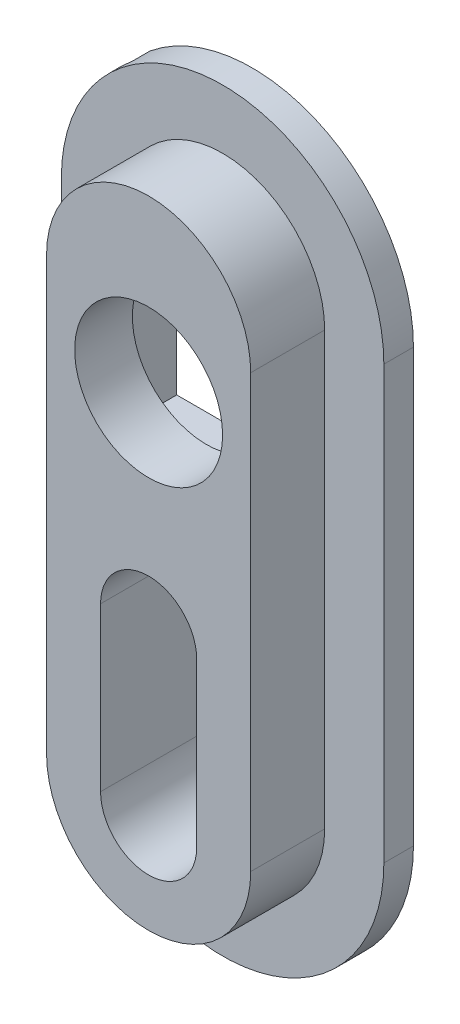
ISO-10303-21;
HEADER;
FILE_DESCRIPTION(('STEP AP214'),'2;1');
FILE_NAME('part.step','',(''),(''),'','','');
FILE_SCHEMA(('AUTOMOTIVE_DESIGN { 1 0 10303 214 1 1 1 1 }'));
ENDSEC;
DATA;
#1=APPLICATION_CONTEXT('core data for automotive mechanical design processes');
#2=APPLICATION_PROTOCOL_DEFINITION('international standard','automotive_design',2000,#1);
#3=PRODUCT_CONTEXT('',#1,'mechanical');
#4=PRODUCT('Part','Part','',(#3));
#5=PRODUCT_RELATED_PRODUCT_CATEGORY('part','',(#4));
#6=PRODUCT_DEFINITION_FORMATION('','',#4);
#7=PRODUCT_DEFINITION_CONTEXT('part definition',#1,'design');
#8=PRODUCT_DEFINITION('design','',#6,#7);
#9=PRODUCT_DEFINITION_SHAPE('','',#8);
#10=(LENGTH_UNIT() NAMED_UNIT(*) SI_UNIT(.MILLI.,.METRE.));
#11=(NAMED_UNIT(*) PLANE_ANGLE_UNIT() SI_UNIT($,.RADIAN.));
#12=(NAMED_UNIT(*) SI_UNIT($,.STERADIAN.) SOLID_ANGLE_UNIT());
#13=UNCERTAINTY_MEASURE_WITH_UNIT(LENGTH_MEASURE(1.E-05),#10,'distance_accuracy_value','');
#14=(GEOMETRIC_REPRESENTATION_CONTEXT(3) GLOBAL_UNCERTAINTY_ASSIGNED_CONTEXT((#13)) GLOBAL_UNIT_ASSIGNED_CONTEXT((#10,
#11,#12)) REPRESENTATION_CONTEXT('',''));
#15=CARTESIAN_POINT('',(0.,0.,0.));
#16=DIRECTION('',(0.,0.,1.));
#17=DIRECTION('',(1.,0.,0.));
#18=AXIS2_PLACEMENT_3D('',#15,#16,#17);
#19=CARTESIAN_POINT('',(-5.45,-7.3,-3.5));
#20=DIRECTION('',(1.,0.,0.));
#21=DIRECTION('',(0.,1.,0.));
#22=AXIS2_PLACEMENT_3D('',#19,#20,#21);
#23=PLANE('',#22);
#24=DIRECTION('',(0.,-1.,0.));
#25=VECTOR('',#24,1.);
#26=CARTESIAN_POINT('',(-5.45,7.30000000000004,-2.9));
#27=LINE('',#26,#25);
#28=CARTESIAN_POINT('',(-5.45,7.3,-2.9));
#29=VERTEX_POINT('',#28);
#30=CARTESIAN_POINT('',(-5.45,-7.29999999999997,-2.9));
#31=VERTEX_POINT('',#30);
#32=EDGE_CURVE('E67',#29,#31,#27,.T.);
#33=ORIENTED_EDGE('',*,*,#32,.T.);
#34=DIRECTION('',(0.,0.,1.));
#35=VECTOR('',#34,1.);
#36=CARTESIAN_POINT('',(-5.45,-7.3,-3.5));
#37=LINE('',#36,#35);
#38=CARTESIAN_POINT('',(-5.45,-7.3,-2.5));
#39=VERTEX_POINT('',#38);
#40=EDGE_CURVE('E235',#31,#39,#37,.T.);
#41=ORIENTED_EDGE('',*,*,#40,.T.);
#42=DIRECTION('',(0.,1.,0.));
#43=VECTOR('',#42,1.);
#44=CARTESIAN_POINT('',(-5.45,-7.3,-2.5));
#45=LINE('',#44,#43);
#46=CARTESIAN_POINT('',(-5.45,7.3,-2.5));
#47=VERTEX_POINT('',#46);
#48=EDGE_CURVE('E217',#39,#47,#45,.T.);
#49=ORIENTED_EDGE('',*,*,#48,.T.);
#50=DIRECTION('',(0.,0.,1.));
#51=VECTOR('',#50,1.);
#52=CARTESIAN_POINT('',(-5.45,7.3,-3.5));
#53=LINE('',#52,#51);
#54=EDGE_CURVE('E232',#29,#47,#53,.T.);
#55=ORIENTED_EDGE('',*,*,#54,.F.);
#56=EDGE_LOOP('',(#33,#41,#49,#55));
#57=FACE_BOUND('',#56,.T.);
#58=ADVANCED_FACE('F49',(#57),#23,.F.);
#59=CARTESIAN_POINT('',(0.,-7.3,-2.5));
#60=DIRECTION('',(0.,0.,1.));
#61=DIRECTION('',(1.,0.,0.));
#62=AXIS2_PLACEMENT_3D('',#59,#60,#61);
#63=CYLINDRICAL_SURFACE('',#62,3.45);
#64=CARTESIAN_POINT('',(0.,-7.3,0.));
#65=DIRECTION('',(0.,0.,1.));
#66=DIRECTION('',(1.,0.,0.));
#67=AXIS2_PLACEMENT_3D('',#64,#65,#66);
#68=CIRCLE('',#67,3.45);
#69=CARTESIAN_POINT('',(-3.45,-7.3,0.));
#70=VERTEX_POINT('',#69);
#71=CARTESIAN_POINT('',(3.45,-7.3,0.));
#72=VERTEX_POINT('',#71);
#73=EDGE_CURVE('E257',#70,#72,#68,.T.);
#74=ORIENTED_EDGE('',*,*,#73,.F.);
#75=DIRECTION('',(0.,0.,1.));
#76=VECTOR('',#75,1.);
#77=CARTESIAN_POINT('',(-3.45,-7.3,-2.5));
#78=LINE('',#77,#76);
#79=CARTESIAN_POINT('',(-3.45,-7.3,-2.5));
#80=VERTEX_POINT('',#79);
#81=EDGE_CURVE('E12',#80,#70,#78,.T.);
#82=ORIENTED_EDGE('',*,*,#81,.F.);
#83=CARTESIAN_POINT('',(0.,-7.3,-2.5));
#84=DIRECTION('',(0.,0.,1.));
#85=DIRECTION('',(1.,0.,0.));
#86=AXIS2_PLACEMENT_3D('',#83,#84,#85);
#87=CIRCLE('',#86,3.45);
#88=CARTESIAN_POINT('',(3.45,-7.3,-2.5));
#89=VERTEX_POINT('',#88);
#90=EDGE_CURVE('E269',#80,#89,#87,.T.);
#91=ORIENTED_EDGE('',*,*,#90,.T.);
#92=DIRECTION('',(0.,0.,1.));
#93=VECTOR('',#92,1.);
#94=CARTESIAN_POINT('',(3.45,-7.3,-2.5));
#95=LINE('',#94,#93);
#96=EDGE_CURVE('E286',#89,#72,#95,.T.);
#97=ORIENTED_EDGE('',*,*,#96,.T.);
#98=EDGE_LOOP('',(#74,#82,#91,#97));
#99=FACE_BOUND('',#98,.T.);
#100=ADVANCED_FACE('F51',(#99),#63,.T.);
#101=CARTESIAN_POINT('',(-3.45,-7.3,-2.5));
#102=DIRECTION('',(-1.,0.,0.));
#103=DIRECTION('',(0.,0.,1.));
#104=AXIS2_PLACEMENT_3D('',#101,#102,#103);
#105=PLANE('',#104);
#106=DIRECTION('',(0.,-1.,0.));
#107=VECTOR('',#106,1.);
#108=CARTESIAN_POINT('',(-3.45,-7.3,0.));
#109=LINE('',#108,#107);
#110=CARTESIAN_POINT('',(-3.45,7.3,0.));
#111=VERTEX_POINT('',#110);
#112=EDGE_CURVE('E274',#111,#70,#109,.T.);
#113=ORIENTED_EDGE('',*,*,#112,.F.);
#114=DIRECTION('',(0.,0.,1.));
#115=VECTOR('',#114,1.);
#116=CARTESIAN_POINT('',(-3.45,7.3,-2.5));
#117=LINE('',#116,#115);
#118=CARTESIAN_POINT('',(-3.45,7.3,-2.5));
#119=VERTEX_POINT('',#118);
#120=EDGE_CURVE('E59',#119,#111,#117,.T.);
#121=ORIENTED_EDGE('',*,*,#120,.F.);
#122=DIRECTION('',(0.,-1.,0.));
#123=VECTOR('',#122,1.);
#124=CARTESIAN_POINT('',(-3.45,-7.3,-2.5));
#125=LINE('',#124,#123);
#126=EDGE_CURVE('E282',#119,#80,#125,.T.);
#127=ORIENTED_EDGE('',*,*,#126,.T.);
#128=ORIENTED_EDGE('',*,*,#81,.T.);
#129=EDGE_LOOP('',(#113,#121,#127,#128));
#130=FACE_BOUND('',#129,.T.);
#131=ADVANCED_FACE('F320',(#130),#105,.T.);
#132=CARTESIAN_POINT('',(0.,7.3,-2.5));
#133=DIRECTION('',(0.,0.,1.));
#134=DIRECTION('',(1.,0.,0.));
#135=AXIS2_PLACEMENT_3D('',#132,#133,#134);
#136=CYLINDRICAL_SURFACE('',#135,3.45);
#137=CARTESIAN_POINT('',(0.,7.3,0.));
#138=DIRECTION('',(0.,0.,1.));
#139=DIRECTION('',(1.,0.,0.));
#140=AXIS2_PLACEMENT_3D('',#137,#138,#139);
#141=CIRCLE('',#140,3.45);
#142=CARTESIAN_POINT('',(3.45,7.3,0.));
#143=VERTEX_POINT('',#142);
#144=EDGE_CURVE('E294',#143,#111,#141,.T.);
#145=ORIENTED_EDGE('',*,*,#144,.F.);
#146=DIRECTION('',(0.,0.,1.));
#147=VECTOR('',#146,1.);
#148=CARTESIAN_POINT('',(3.45,7.3,-2.5));
#149=LINE('',#148,#147);
#150=CARTESIAN_POINT('',(3.45,7.3,-2.5));
#151=VERTEX_POINT('',#150);
#152=EDGE_CURVE('E303',#151,#143,#149,.T.);
#153=ORIENTED_EDGE('',*,*,#152,.F.);
#154=CARTESIAN_POINT('',(0.,7.3,-2.5));
#155=DIRECTION('',(0.,0.,1.));
#156=DIRECTION('',(1.,0.,0.));
#157=AXIS2_PLACEMENT_3D('',#154,#155,#156);
#158=CIRCLE('',#157,3.45);
#159=EDGE_CURVE('E278',#151,#119,#158,.T.);
#160=ORIENTED_EDGE('',*,*,#159,.T.);
#161=ORIENTED_EDGE('',*,*,#120,.T.);
#162=EDGE_LOOP('',(#145,#153,#160,#161));
#163=FACE_BOUND('',#162,.T.);
#164=ADVANCED_FACE('F325',(#163),#136,.T.);
#165=CARTESIAN_POINT('',(3.45,-7.3,-2.5));
#166=DIRECTION('',(1.,0.,0.));
#167=DIRECTION('',(0.,0.,-1.));
#168=AXIS2_PLACEMENT_3D('',#165,#166,#167);
#169=PLANE('',#168);
#170=DIRECTION('',(0.,1.,0.));
#171=VECTOR('',#170,1.);
#172=CARTESIAN_POINT('',(3.45,-7.3,0.));
#173=LINE('',#172,#171);
#174=EDGE_CURVE('E290',#72,#143,#173,.T.);
#175=ORIENTED_EDGE('',*,*,#174,.F.);
#176=ORIENTED_EDGE('',*,*,#96,.F.);
#177=DIRECTION('',(0.,1.,0.));
#178=VECTOR('',#177,1.);
#179=CARTESIAN_POINT('',(3.45,-7.3,-2.5));
#180=LINE('',#179,#178);
#181=EDGE_CURVE('E273',#89,#151,#180,.T.);
#182=ORIENTED_EDGE('',*,*,#181,.T.);
#183=ORIENTED_EDGE('',*,*,#152,.T.);
#184=EDGE_LOOP('',(#175,#176,#182,#183));
#185=FACE_BOUND('',#184,.T.);
#186=ADVANCED_FACE('F312',(#185),#169,.T.);
#187=CARTESIAN_POINT('',(0.,-7.3,0.));
#188=DIRECTION('',(0.,0.,1.));
#189=DIRECTION('',(1.,0.,0.));
#190=AXIS2_PLACEMENT_3D('',#187,#188,#189);
#191=PLANE('',#190);
#192=CARTESIAN_POINT('',(0.,-7.5,0.));
#193=DIRECTION('',(0.,0.,1.));
#194=DIRECTION('',(1.,0.,0.));
#195=AXIS2_PLACEMENT_3D('',#192,#193,#194);
#196=CIRCLE('',#195,1.625);
#197=CARTESIAN_POINT('',(-1.625,-7.5,0.));
#198=VERTEX_POINT('',#197);
#199=CARTESIAN_POINT('',(1.625,-7.5,0.));
#200=VERTEX_POINT('',#199);
#201=EDGE_CURVE('E75',#198,#200,#196,.T.);
#202=ORIENTED_EDGE('',*,*,#201,.F.);
#203=DIRECTION('',(0.,-1.,0.));
#204=VECTOR('',#203,1.);
#205=CARTESIAN_POINT('',(-1.625,-7.5,0.));
#206=LINE('',#205,#204);
#207=CARTESIAN_POINT('',(-1.625,-2.,0.));
#208=VERTEX_POINT('',#207);
#209=EDGE_CURVE('E249',#208,#198,#206,.T.);
#210=ORIENTED_EDGE('',*,*,#209,.F.);
#211=CARTESIAN_POINT('',(0.,-2.,0.));
#212=DIRECTION('',(0.,0.,1.));
#213=DIRECTION('',(1.,0.,0.));
#214=AXIS2_PLACEMENT_3D('',#211,#212,#213);
#215=CIRCLE('',#214,1.625);
#216=CARTESIAN_POINT('',(1.625,-2.,0.));
#217=VERTEX_POINT('',#216);
#218=EDGE_CURVE('E245',#217,#208,#215,.T.);
#219=ORIENTED_EDGE('',*,*,#218,.F.);
#220=DIRECTION('',(0.,1.,0.));
#221=VECTOR('',#220,1.);
#222=CARTESIAN_POINT('',(1.625,-7.5,0.));
#223=LINE('',#222,#221);
#224=EDGE_CURVE('E241',#200,#217,#223,.T.);
#225=ORIENTED_EDGE('',*,*,#224,.F.);
#226=EDGE_LOOP('',(#202,#210,#219,#225));
#227=FACE_BOUND('',#226,.T.);
#228=CARTESIAN_POINT('',(0.,5.,0.));
#229=DIRECTION('',(0.,0.,1.));
#230=DIRECTION('',(1.,0.,0.));
#231=AXIS2_PLACEMENT_3D('',#228,#229,#230);
#232=CIRCLE('',#231,2.5);
#233=CARTESIAN_POINT('',(2.5,5.,0.));
#234=VERTEX_POINT('',#233);
#235=EDGE_CURVE('E238',#234,#234,#232,.T.);
#236=ORIENTED_EDGE('',*,*,#235,.F.);
#237=EDGE_LOOP('',(#236));
#238=FACE_BOUND('',#237,.T.);
#239=ORIENTED_EDGE('',*,*,#73,.T.);
#240=ORIENTED_EDGE('',*,*,#174,.T.);
#241=ORIENTED_EDGE('',*,*,#144,.T.);
#242=ORIENTED_EDGE('',*,*,#112,.T.);
#243=EDGE_LOOP('',(#239,#240,#241,#242));
#244=FACE_BOUND('',#243,.T.);
#245=ADVANCED_FACE('F316',(#227,#238,#244),#191,.T.);
#246=CARTESIAN_POINT('',(0.,5.,-4.));
#247=DIRECTION('',(0.,0.,1.));
#248=DIRECTION('',(1.,0.,0.));
#249=AXIS2_PLACEMENT_3D('',#246,#247,#248);
#250=CYLINDRICAL_SURFACE('',#249,2.5);
#251=CARTESIAN_POINT('',(0.,5.,-1.95));
#252=DIRECTION('',(0.,0.,1.));
#253=DIRECTION('',(1.,0.,0.));
#254=AXIS2_PLACEMENT_3D('',#251,#252,#253);
#255=CIRCLE('',#254,2.5);
#256=CARTESIAN_POINT('',(2.5,5.,-1.95));
#257=VERTEX_POINT('',#256);
#258=EDGE_CURVE('E53',#257,#257,#255,.F.);
#259=ORIENTED_EDGE('',*,*,#258,.T.);
#260=EDGE_LOOP('',(#259));
#261=FACE_BOUND('',#260,.T.);
#262=ORIENTED_EDGE('',*,*,#235,.T.);
#263=EDGE_LOOP('',(#262));
#264=FACE_BOUND('',#263,.T.);
#265=ADVANCED_FACE('F363',(#261,#264),#250,.F.);
#266=CARTESIAN_POINT('',(0.,-7.5,-4.));
#267=DIRECTION('',(0.,0.,1.));
#268=DIRECTION('',(1.,0.,0.));
#269=AXIS2_PLACEMENT_3D('',#266,#267,#268);
#270=CYLINDRICAL_SURFACE('',#269,1.625);
#271=DIRECTION('',(0.,0.,1.));
#272=VECTOR('',#271,1.);
#273=CARTESIAN_POINT('',(-1.625,-7.5,-4.));
#274=LINE('',#273,#272);
#275=CARTESIAN_POINT('',(-1.625,-7.5,-3.5));
#276=VERTEX_POINT('',#275);
#277=EDGE_CURVE('E254',#276,#198,#274,.T.);
#278=ORIENTED_EDGE('',*,*,#277,.T.);
#279=ORIENTED_EDGE('',*,*,#201,.T.);
#280=DIRECTION('',(0.,0.,1.));
#281=VECTOR('',#280,1.);
#282=CARTESIAN_POINT('',(1.625,-7.5,-4.));
#283=LINE('',#282,#281);
#284=CARTESIAN_POINT('',(1.625,-7.5,-3.5));
#285=VERTEX_POINT('',#284);
#286=EDGE_CURVE('E253',#285,#200,#283,.T.);
#287=ORIENTED_EDGE('',*,*,#286,.F.);
#288=CARTESIAN_POINT('',(0.,-7.5,-3.5));
#289=DIRECTION('',(0.,0.,-1.));
#290=DIRECTION('',(-1.,0.,0.));
#291=AXIS2_PLACEMENT_3D('',#288,#289,#290);
#292=CIRCLE('',#291,1.625);
#293=EDGE_CURVE('E383',#285,#276,#292,.T.);
#294=ORIENTED_EDGE('',*,*,#293,.T.);
#295=EDGE_LOOP('',(#278,#279,#287,#294));
#296=FACE_BOUND('',#295,.T.);
#297=ADVANCED_FACE('F352',(#296),#270,.F.);
#298=CARTESIAN_POINT('',(-1.625,-7.5,-4.));
#299=DIRECTION('',(-1.,0.,0.));
#300=DIRECTION('',(0.,0.,1.));
#301=AXIS2_PLACEMENT_3D('',#298,#299,#300);
#302=PLANE('',#301);
#303=DIRECTION('',(0.,0.,1.));
#304=VECTOR('',#303,1.);
#305=CARTESIAN_POINT('',(-1.625,-2.,-4.));
#306=LINE('',#305,#304);
#307=CARTESIAN_POINT('',(-1.625,-2.,-3.5));
#308=VERTEX_POINT('',#307);
#309=EDGE_CURVE('E258',#308,#208,#306,.T.);
#310=ORIENTED_EDGE('',*,*,#309,.T.);
#311=ORIENTED_EDGE('',*,*,#209,.T.);
#312=ORIENTED_EDGE('',*,*,#277,.F.);
#313=DIRECTION('',(0.,1.,0.));
#314=VECTOR('',#313,1.);
#315=CARTESIAN_POINT('',(-1.625,-7.5,-3.5));
#316=LINE('',#315,#314);
#317=EDGE_CURVE('E387',#276,#308,#316,.T.);
#318=ORIENTED_EDGE('',*,*,#317,.T.);
#319=EDGE_LOOP('',(#310,#311,#312,#318));
#320=FACE_BOUND('',#319,.T.);
#321=ADVANCED_FACE('F348',(#320),#302,.F.);
#322=CARTESIAN_POINT('',(0.,-2.,-4.));
#323=DIRECTION('',(0.,0.,1.));
#324=DIRECTION('',(1.,0.,0.));
#325=AXIS2_PLACEMENT_3D('',#322,#323,#324);
#326=CYLINDRICAL_SURFACE('',#325,1.625);
#327=DIRECTION('',(0.,0.,1.));
#328=VECTOR('',#327,1.);
#329=CARTESIAN_POINT('',(1.625,-2.,-4.));
#330=LINE('',#329,#328);
#331=CARTESIAN_POINT('',(1.625,-2.,-3.5));
#332=VERTEX_POINT('',#331);
#333=EDGE_CURVE('E261',#332,#217,#330,.T.);
#334=ORIENTED_EDGE('',*,*,#333,.T.);
#335=ORIENTED_EDGE('',*,*,#218,.T.);
#336=ORIENTED_EDGE('',*,*,#309,.F.);
#337=CARTESIAN_POINT('',(0.,-2.,-3.5));
#338=DIRECTION('',(0.,0.,-1.));
#339=DIRECTION('',(-1.,0.,0.));
#340=AXIS2_PLACEMENT_3D('',#337,#338,#339);
#341=CIRCLE('',#340,1.625);
#342=EDGE_CURVE('E391',#308,#332,#341,.T.);
#343=ORIENTED_EDGE('',*,*,#342,.T.);
#344=EDGE_LOOP('',(#334,#335,#336,#343));
#345=FACE_BOUND('',#344,.T.);
#346=ADVANCED_FACE('F351',(#345),#326,.F.);
#347=CARTESIAN_POINT('',(1.625,-7.5,-4.));
#348=DIRECTION('',(1.,0.,0.));
#349=DIRECTION('',(0.,0.,-1.));
#350=AXIS2_PLACEMENT_3D('',#347,#348,#349);
#351=PLANE('',#350);
#352=ORIENTED_EDGE('',*,*,#286,.T.);
#353=ORIENTED_EDGE('',*,*,#224,.T.);
#354=ORIENTED_EDGE('',*,*,#333,.F.);
#355=DIRECTION('',(0.,-1.,0.));
#356=VECTOR('',#355,1.);
#357=CARTESIAN_POINT('',(1.625,-2.,-3.5));
#358=LINE('',#357,#356);
#359=EDGE_CURVE('E380',#332,#285,#358,.T.);
#360=ORIENTED_EDGE('',*,*,#359,.T.);
#361=EDGE_LOOP('',(#352,#353,#354,#360));
#362=FACE_BOUND('',#361,.T.);
#363=ADVANCED_FACE('F356',(#362),#351,.F.);
#364=CARTESIAN_POINT('',(0.,-7.3,-3.5));
#365=DIRECTION('',(0.,0.,-1.));
#366=DIRECTION('',(-1.,0.,0.));
#367=AXIS2_PLACEMENT_3D('',#364,#365,#366);
#368=PLANE('',#367);
#369=DIRECTION('',(0.,-1.,0.));
#370=VECTOR('',#369,1.);
#371=CARTESIAN_POINT('',(-3.45,-11.5190046219458,-3.5));
#372=LINE('',#371,#370);
#373=CARTESIAN_POINT('',(-3.45,11.5190046219458,-3.5));
#374=VERTEX_POINT('',#373);
#375=CARTESIAN_POINT('',(-3.45,-11.5190046219458,-3.5));
#376=VERTEX_POINT('',#375);
#377=EDGE_CURVE('E179',#374,#376,#372,.T.);
#378=ORIENTED_EDGE('',*,*,#377,.F.);
#379=CARTESIAN_POINT('',(0.,7.3,-3.5));
#380=DIRECTION('',(0.,0.,-1.));
#381=DIRECTION('',(-1.,0.,0.));
#382=AXIS2_PLACEMENT_3D('',#379,#380,#381);
#383=CIRCLE('',#382,5.45);
#384=CARTESIAN_POINT('',(5.45,7.3,-3.5));
#385=VERTEX_POINT('',#384);
#386=EDGE_CURVE('E192',#374,#385,#383,.T.);
#387=ORIENTED_EDGE('',*,*,#386,.T.);
#388=DIRECTION('',(0.,-1.,0.));
#389=VECTOR('',#388,1.);
#390=CARTESIAN_POINT('',(5.45,7.3,-3.5));
#391=LINE('',#390,#389);
#392=CARTESIAN_POINT('',(5.45,-7.3,-3.5));
#393=VERTEX_POINT('',#392);
#394=EDGE_CURVE('E203',#385,#393,#391,.T.);
#395=ORIENTED_EDGE('',*,*,#394,.T.);
#396=CARTESIAN_POINT('',(0.,-7.3,-3.5));
#397=DIRECTION('',(0.,0.,-1.));
#398=DIRECTION('',(-1.,0.,0.));
#399=AXIS2_PLACEMENT_3D('',#396,#397,#398);
#400=CIRCLE('',#399,5.45);
#401=EDGE_CURVE('E195',#393,#376,#400,.T.);
#402=ORIENTED_EDGE('',*,*,#401,.T.);
#403=EDGE_LOOP('',(#378,#387,#395,#402));
#404=FACE_BOUND('',#403,.T.);
#405=DIRECTION('',(0.,1.,0.));
#406=VECTOR('',#405,1.);
#407=CARTESIAN_POINT('',(-2.55,1.9,-3.5));
#408=LINE('',#407,#406);
#409=CARTESIAN_POINT('',(-2.55,1.9,-3.5));
#410=VERTEX_POINT('',#409);
#411=CARTESIAN_POINT('',(-2.55,8.1,-3.5));
#412=VERTEX_POINT('',#411);
#413=EDGE_CURVE('E396',#410,#412,#408,.T.);
#414=ORIENTED_EDGE('',*,*,#413,.F.);
#415=DIRECTION('',(-1.,0.,0.));
#416=VECTOR('',#415,1.);
#417=CARTESIAN_POINT('',(2.55,1.9,-3.5));
#418=LINE('',#417,#416);
#419=CARTESIAN_POINT('',(2.55,1.9,-3.5));
#420=VERTEX_POINT('',#419);
#421=EDGE_CURVE('E393',#420,#410,#418,.T.);
#422=ORIENTED_EDGE('',*,*,#421,.F.);
#423=DIRECTION('',(0.,-1.,0.));
#424=VECTOR('',#423,1.);
#425=CARTESIAN_POINT('',(2.55,8.1,-3.5));
#426=LINE('',#425,#424);
#427=CARTESIAN_POINT('',(2.55,8.1,-3.5));
#428=VERTEX_POINT('',#427);
#429=EDGE_CURVE('E406',#428,#420,#426,.T.);
#430=ORIENTED_EDGE('',*,*,#429,.F.);
#431=DIRECTION('',(1.,0.,0.));
#432=VECTOR('',#431,1.);
#433=CARTESIAN_POINT('',(-2.55,8.1,-3.5));
#434=LINE('',#433,#432);
#435=EDGE_CURVE('E402',#412,#428,#434,.T.);
#436=ORIENTED_EDGE('',*,*,#435,.F.);
#437=EDGE_LOOP('',(#414,#422,#430,#436));
#438=FACE_BOUND('',#437,.T.);
#439=ORIENTED_EDGE('',*,*,#359,.F.);
#440=ORIENTED_EDGE('',*,*,#342,.F.);
#441=ORIENTED_EDGE('',*,*,#317,.F.);
#442=ORIENTED_EDGE('',*,*,#293,.F.);
#443=EDGE_LOOP('',(#439,#440,#441,#442));
#444=FACE_BOUND('',#443,.T.);
#445=ADVANCED_FACE('F190',(#404,#438,#444),#368,.T.);
#446=CARTESIAN_POINT('',(0.,-7.3,-2.5));
#447=DIRECTION('',(0.,0.,-1.));
#448=DIRECTION('',(-1.,0.,0.));
#449=AXIS2_PLACEMENT_3D('',#446,#447,#448);
#450=PLANE('',#449);
#451=ORIENTED_EDGE('',*,*,#90,.F.);
#452=ORIENTED_EDGE('',*,*,#126,.F.);
#453=ORIENTED_EDGE('',*,*,#159,.F.);
#454=ORIENTED_EDGE('',*,*,#181,.F.);
#455=EDGE_LOOP('',(#451,#452,#453,#454));
#456=FACE_BOUND('',#455,.T.);
#457=CARTESIAN_POINT('',(0.,-7.3,-2.5));
#458=DIRECTION('',(0.,0.,-1.));
#459=DIRECTION('',(-1.,0.,0.));
#460=AXIS2_PLACEMENT_3D('',#457,#458,#459);
#461=CIRCLE('',#460,5.45);
#462=CARTESIAN_POINT('',(5.45,-7.3,-2.5));
#463=VERTEX_POINT('',#462);
#464=EDGE_CURVE('E213',#463,#39,#461,.T.);
#465=ORIENTED_EDGE('',*,*,#464,.F.);
#466=DIRECTION('',(0.,-1.,0.));
#467=VECTOR('',#466,1.);
#468=CARTESIAN_POINT('',(5.45,7.3,-2.5));
#469=LINE('',#468,#467);
#470=CARTESIAN_POINT('',(5.45,7.3,-2.5));
#471=VERTEX_POINT('',#470);
#472=EDGE_CURVE('E209',#471,#463,#469,.T.);
#473=ORIENTED_EDGE('',*,*,#472,.F.);
#474=CARTESIAN_POINT('',(0.,7.3,-2.5));
#475=DIRECTION('',(0.,0.,-1.));
#476=DIRECTION('',(-1.,0.,0.));
#477=AXIS2_PLACEMENT_3D('',#474,#475,#476);
#478=CIRCLE('',#477,5.45);
#479=EDGE_CURVE('E222',#47,#471,#478,.T.);
#480=ORIENTED_EDGE('',*,*,#479,.F.);
#481=ORIENTED_EDGE('',*,*,#48,.F.);
#482=EDGE_LOOP('',(#465,#473,#480,#481));
#483=FACE_BOUND('',#482,.T.);
#484=ADVANCED_FACE('F322',(#456,#483),#450,.F.);
#485=CARTESIAN_POINT('',(0.,-7.3,-3.5));
#486=DIRECTION('',(0.,0.,1.));
#487=DIRECTION('',(1.,0.,0.));
#488=AXIS2_PLACEMENT_3D('',#485,#486,#487);
#489=CYLINDRICAL_SURFACE('',#488,5.45);
#490=CARTESIAN_POINT('',(0.,-7.29999999999997,-2.9));
#491=DIRECTION('',(0.,0.,-1.));
#492=DIRECTION('',(-1.,0.,0.));
#493=AXIS2_PLACEMENT_3D('',#490,#491,#492);
#494=CIRCLE('',#493,5.45000000000005);
#495=CARTESIAN_POINT('',(-3.45,-11.5190046219458,-2.9));
#496=VERTEX_POINT('',#495);
#497=EDGE_CURVE('E491',#31,#496,#494,.F.);
#498=ORIENTED_EDGE('',*,*,#497,.T.);
#499=DIRECTION('',(0.,0.,-1.));
#500=VECTOR('',#499,1.);
#501=CARTESIAN_POINT('',(-3.45,-11.5190046219458,20.6246593471479));
#502=LINE('',#501,#500);
#503=EDGE_CURVE('E186',#496,#376,#502,.T.);
#504=ORIENTED_EDGE('',*,*,#503,.T.);
#505=ORIENTED_EDGE('',*,*,#401,.F.);
#506=DIRECTION('',(0.,0.,1.));
#507=VECTOR('',#506,1.);
#508=CARTESIAN_POINT('',(5.45,-7.3,-3.5));
#509=LINE('',#508,#507);
#510=EDGE_CURVE('E207',#393,#463,#509,.T.);
#511=ORIENTED_EDGE('',*,*,#510,.T.);
#512=ORIENTED_EDGE('',*,*,#464,.T.);
#513=ORIENTED_EDGE('',*,*,#40,.F.);
#514=EDGE_LOOP('',(#498,#504,#505,#511,#512,#513));
#515=FACE_BOUND('',#514,.T.);
#516=ADVANCED_FACE('F344',(#515),#489,.T.);
#517=CARTESIAN_POINT('',(0.,7.3,-3.5));
#518=DIRECTION('',(0.,0.,1.));
#519=DIRECTION('',(1.,0.,0.));
#520=AXIS2_PLACEMENT_3D('',#517,#518,#519);
#521=CYLINDRICAL_SURFACE('',#520,5.45);
#522=ORIENTED_EDGE('',*,*,#386,.F.);
#523=DIRECTION('',(0.,0.,-1.));
#524=VECTOR('',#523,1.);
#525=CARTESIAN_POINT('',(-3.45,11.5190046219458,20.6246593471479));
#526=LINE('',#525,#524);
#527=CARTESIAN_POINT('',(-3.45,11.5190046219458,-2.9));
#528=VERTEX_POINT('',#527);
#529=EDGE_CURVE('E176',#528,#374,#526,.T.);
#530=ORIENTED_EDGE('',*,*,#529,.F.);
#531=CARTESIAN_POINT('',(0.,7.29999999999998,-2.9));
#532=DIRECTION('',(0.,0.,-1.));
#533=DIRECTION('',(-1.,0.,0.));
#534=AXIS2_PLACEMENT_3D('',#531,#532,#533);
#535=CIRCLE('',#534,5.45000000000004);
#536=EDGE_CURVE('E496',#528,#29,#535,.F.);
#537=ORIENTED_EDGE('',*,*,#536,.T.);
#538=ORIENTED_EDGE('',*,*,#54,.T.);
#539=ORIENTED_EDGE('',*,*,#479,.T.);
#540=DIRECTION('',(0.,0.,1.));
#541=VECTOR('',#540,1.);
#542=CARTESIAN_POINT('',(5.45,7.3,-3.5));
#543=LINE('',#542,#541);
#544=EDGE_CURVE('E200',#385,#471,#543,.T.);
#545=ORIENTED_EDGE('',*,*,#544,.F.);
#546=EDGE_LOOP('',(#522,#530,#537,#538,#539,#545));
#547=FACE_BOUND('',#546,.T.);
#548=ADVANCED_FACE('F198',(#547),#521,.T.);
#549=CARTESIAN_POINT('',(5.45,7.3,-3.5));
#550=DIRECTION('',(-1.,0.,0.));
#551=DIRECTION('',(0.,-1.,0.));
#552=AXIS2_PLACEMENT_3D('',#549,#550,#551);
#553=PLANE('',#552);
#554=ORIENTED_EDGE('',*,*,#472,.T.);
#555=ORIENTED_EDGE('',*,*,#510,.F.);
#556=ORIENTED_EDGE('',*,*,#394,.F.);
#557=ORIENTED_EDGE('',*,*,#544,.T.);
#558=EDGE_LOOP('',(#554,#555,#556,#557));
#559=FACE_BOUND('',#558,.T.);
#560=ADVANCED_FACE('F475',(#559),#553,.F.);
#561=CARTESIAN_POINT('',(2.55,1.9,-3.5));
#562=DIRECTION('',(0.,1.,0.));
#563=DIRECTION('',(-1.,0.,0.));
#564=AXIS2_PLACEMENT_3D('',#561,#562,#563);
#565=PLANE('',#564);
#566=DIRECTION('',(0.,0.,1.));
#567=VECTOR('',#566,1.);
#568=CARTESIAN_POINT('',(-2.55,1.9,-3.5));
#569=LINE('',#568,#567);
#570=CARTESIAN_POINT('',(-2.55,1.9,-1.95));
#571=VERTEX_POINT('',#570);
#572=EDGE_CURVE('E218',#410,#571,#569,.T.);
#573=ORIENTED_EDGE('',*,*,#572,.T.);
#574=DIRECTION('',(-1.,0.,0.));
#575=VECTOR('',#574,1.);
#576=CARTESIAN_POINT('',(-2.55,1.9,-1.95));
#577=LINE('',#576,#575);
#578=CARTESIAN_POINT('',(2.55,1.9,-1.95));
#579=VERTEX_POINT('',#578);
#580=EDGE_CURVE('E425',#579,#571,#577,.T.);
#581=ORIENTED_EDGE('',*,*,#580,.F.);
#582=DIRECTION('',(0.,0.,1.));
#583=VECTOR('',#582,1.);
#584=CARTESIAN_POINT('',(2.55,1.9,-3.5));
#585=LINE('',#584,#583);
#586=EDGE_CURVE('E409',#420,#579,#585,.T.);
#587=ORIENTED_EDGE('',*,*,#586,.F.);
#588=ORIENTED_EDGE('',*,*,#421,.T.);
#589=EDGE_LOOP('',(#573,#581,#587,#588));
#590=FACE_BOUND('',#589,.T.);
#591=ADVANCED_FACE('F422',(#590),#565,.T.);
#592=CARTESIAN_POINT('',(-2.55,1.9,-3.5));
#593=DIRECTION('',(1.,0.,0.));
#594=DIRECTION('',(0.,0.,-1.));
#595=AXIS2_PLACEMENT_3D('',#592,#593,#594);
#596=PLANE('',#595);
#597=DIRECTION('',(0.,0.,1.));
#598=VECTOR('',#597,1.);
#599=CARTESIAN_POINT('',(-2.55,8.1,-3.5));
#600=LINE('',#599,#598);
#601=CARTESIAN_POINT('',(-2.55,8.1,-1.95));
#602=VERTEX_POINT('',#601);
#603=EDGE_CURVE('E415',#412,#602,#600,.T.);
#604=ORIENTED_EDGE('',*,*,#603,.T.);
#605=DIRECTION('',(0.,1.,0.));
#606=VECTOR('',#605,1.);
#607=CARTESIAN_POINT('',(-2.55,8.1,-1.95));
#608=LINE('',#607,#606);
#609=EDGE_CURVE('E431',#571,#602,#608,.T.);
#610=ORIENTED_EDGE('',*,*,#609,.F.);
#611=ORIENTED_EDGE('',*,*,#572,.F.);
#612=ORIENTED_EDGE('',*,*,#413,.T.);
#613=EDGE_LOOP('',(#604,#610,#611,#612));
#614=FACE_BOUND('',#613,.T.);
#615=ADVANCED_FACE('F432',(#614),#596,.T.);
#616=CARTESIAN_POINT('',(-2.55,8.1,-3.5));
#617=DIRECTION('',(0.,-1.,0.));
#618=DIRECTION('',(0.,0.,-1.));
#619=AXIS2_PLACEMENT_3D('',#616,#617,#618);
#620=PLANE('',#619);
#621=DIRECTION('',(0.,0.,1.));
#622=VECTOR('',#621,1.);
#623=CARTESIAN_POINT('',(2.55,8.1,-3.5));
#624=LINE('',#623,#622);
#625=CARTESIAN_POINT('',(2.55,8.1,-1.95));
#626=VERTEX_POINT('',#625);
#627=EDGE_CURVE('E412',#428,#626,#624,.T.);
#628=ORIENTED_EDGE('',*,*,#627,.T.);
#629=DIRECTION('',(1.,0.,0.));
#630=VECTOR('',#629,1.);
#631=CARTESIAN_POINT('',(-2.55,8.1,-1.95));
#632=LINE('',#631,#630);
#633=EDGE_CURVE('E446',#602,#626,#632,.T.);
#634=ORIENTED_EDGE('',*,*,#633,.F.);
#635=ORIENTED_EDGE('',*,*,#603,.F.);
#636=ORIENTED_EDGE('',*,*,#435,.T.);
#637=EDGE_LOOP('',(#628,#634,#635,#636));
#638=FACE_BOUND('',#637,.T.);
#639=ADVANCED_FACE('F463',(#638),#620,.T.);
#640=CARTESIAN_POINT('',(2.55,8.1,-3.5));
#641=DIRECTION('',(-1.,0.,0.));
#642=DIRECTION('',(0.,0.,1.));
#643=AXIS2_PLACEMENT_3D('',#640,#641,#642);
#644=PLANE('',#643);
#645=ORIENTED_EDGE('',*,*,#586,.T.);
#646=DIRECTION('',(0.,-1.,0.));
#647=VECTOR('',#646,1.);
#648=CARTESIAN_POINT('',(2.55,8.1,-1.95));
#649=LINE('',#648,#647);
#650=EDGE_CURVE('E442',#626,#579,#649,.T.);
#651=ORIENTED_EDGE('',*,*,#650,.F.);
#652=ORIENTED_EDGE('',*,*,#627,.F.);
#653=ORIENTED_EDGE('',*,*,#429,.T.);
#654=EDGE_LOOP('',(#645,#651,#652,#653));
#655=FACE_BOUND('',#654,.T.);
#656=ADVANCED_FACE('F455',(#655),#644,.T.);
#657=CARTESIAN_POINT('',(0.,-7.3,-1.95));
#658=DIRECTION('',(0.,0.,1.));
#659=DIRECTION('',(1.,0.,0.));
#660=AXIS2_PLACEMENT_3D('',#657,#658,#659);
#661=PLANE('',#660);
#662=ORIENTED_EDGE('',*,*,#609,.T.);
#663=ORIENTED_EDGE('',*,*,#633,.T.);
#664=ORIENTED_EDGE('',*,*,#650,.T.);
#665=ORIENTED_EDGE('',*,*,#580,.T.);
#666=EDGE_LOOP('',(#662,#663,#664,#665));
#667=FACE_BOUND('',#666,.T.);
#668=ORIENTED_EDGE('',*,*,#258,.F.);
#669=EDGE_LOOP('',(#668));
#670=FACE_BOUND('',#669,.T.);
#671=ADVANCED_FACE('F439',(#667,#670),#661,.F.);
#672=CARTESIAN_POINT('',(-3.45,-11.5190046219458,20.6246593471479));
#673=DIRECTION('',(1.,0.,0.));
#674=DIRECTION('',(0.,1.,0.));
#675=AXIS2_PLACEMENT_3D('',#672,#673,#674);
#676=PLANE('',#675);
#677=DIRECTION('',(0.,1.,0.));
#678=VECTOR('',#677,1.);
#679=CARTESIAN_POINT('',(-3.45,-11.5190046219458,-2.9));
#680=LINE('',#679,#678);
#681=EDGE_CURVE('E182',#496,#528,#680,.T.);
#682=ORIENTED_EDGE('',*,*,#681,.T.);
#683=ORIENTED_EDGE('',*,*,#529,.T.);
#684=ORIENTED_EDGE('',*,*,#377,.T.);
#685=ORIENTED_EDGE('',*,*,#503,.F.);
#686=EDGE_LOOP('',(#682,#683,#684,#685));
#687=FACE_BOUND('',#686,.T.);
#688=ADVANCED_FACE('F178',(#687),#676,.F.);
#689=CARTESIAN_POINT('',(0.,-7.3,-2.9));
#690=DIRECTION('',(0.,0.,-1.));
#691=DIRECTION('',(-1.,0.,0.));
#692=AXIS2_PLACEMENT_3D('',#689,#690,#691);
#693=PLANE('',#692);
#694=ORIENTED_EDGE('',*,*,#536,.F.);
#695=ORIENTED_EDGE('',*,*,#681,.F.);
#696=ORIENTED_EDGE('',*,*,#497,.F.);
#697=ORIENTED_EDGE('',*,*,#32,.F.);
#698=EDGE_LOOP('',(#694,#695,#696,#697));
#699=FACE_BOUND('',#698,.T.);
#700=ADVANCED_FACE('F461',(#699),#693,.T.);
#701=CLOSED_SHELL('',(#58,#100,#131,#164,#186,#245,#265,#297,#321,#346,#363,#445,#484,#516,#548,
#560,#591,#615,#639,#656,#671,#688,#700));
#702=MANIFOLD_SOLID_BREP('B2',#701);
#703=ADVANCED_BREP_SHAPE_REPRESENTATION('',(#18,#702),#14);
#704=SHAPE_DEFINITION_REPRESENTATION(#9,#703);
ENDSEC;
END-ISO-10303-21;
